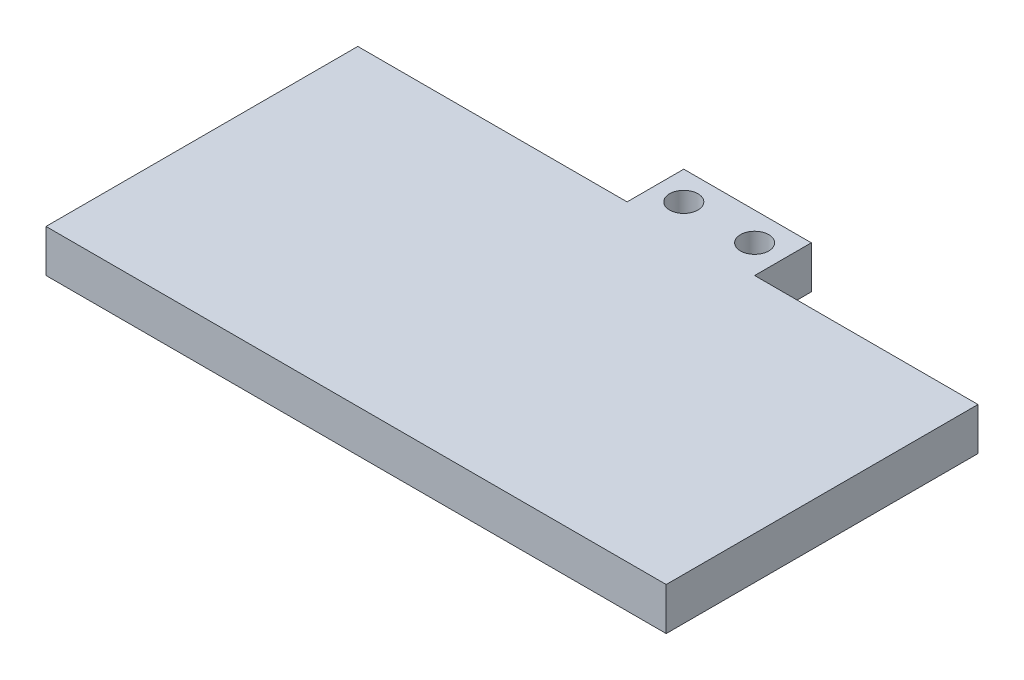
ISO-10303-21;
HEADER;
FILE_DESCRIPTION(('STEP AP214'),'2;1');
FILE_NAME('part.step','',(''),(''),'','','');
FILE_SCHEMA(('AUTOMOTIVE_DESIGN { 1 0 10303 214 1 1 1 1 }'));
ENDSEC;
DATA;
#1=APPLICATION_CONTEXT('core data for automotive mechanical design processes');
#2=APPLICATION_PROTOCOL_DEFINITION('international standard','automotive_design',2000,#1);
#3=PRODUCT_CONTEXT('',#1,'mechanical');
#4=PRODUCT('Part','Part','',(#3));
#5=PRODUCT_RELATED_PRODUCT_CATEGORY('part','',(#4));
#6=PRODUCT_DEFINITION_FORMATION('','',#4);
#7=PRODUCT_DEFINITION_CONTEXT('part definition',#1,'design');
#8=PRODUCT_DEFINITION('design','',#6,#7);
#9=PRODUCT_DEFINITION_SHAPE('','',#8);
#10=(LENGTH_UNIT() NAMED_UNIT(*) SI_UNIT(.MILLI.,.METRE.));
#11=(NAMED_UNIT(*) PLANE_ANGLE_UNIT() SI_UNIT($,.RADIAN.));
#12=(NAMED_UNIT(*) SI_UNIT($,.STERADIAN.) SOLID_ANGLE_UNIT());
#13=UNCERTAINTY_MEASURE_WITH_UNIT(LENGTH_MEASURE(1.E-05),#10,'distance_accuracy_value','');
#14=(GEOMETRIC_REPRESENTATION_CONTEXT(3) GLOBAL_UNCERTAINTY_ASSIGNED_CONTEXT((#13)) GLOBAL_UNIT_ASSIGNED_CONTEXT((#10,
#11,#12)) REPRESENTATION_CONTEXT('',''));
#15=CARTESIAN_POINT('',(0.,0.,0.));
#16=DIRECTION('',(0.,0.,1.));
#17=DIRECTION('',(1.,0.,0.));
#18=AXIS2_PLACEMENT_3D('',#15,#16,#17);
#19=CARTESIAN_POINT('',(0.,19.05,-139.7));
#20=DIRECTION('',(0.,0.,1.));
#21=DIRECTION('',(1.,0.,0.));
#22=AXIS2_PLACEMENT_3D('',#19,#20,#21);
#23=PLANE('',#22);
#24=DIRECTION('',(0.,1.,0.));
#25=VECTOR('',#24,1.);
#26=CARTESIAN_POINT('',(120.65,0.,-139.7));
#27=LINE('',#26,#25);
#28=CARTESIAN_POINT('',(120.65,0.,-139.7));
#29=VERTEX_POINT('',#28);
#30=CARTESIAN_POINT('',(120.65,19.05,-139.7));
#31=VERTEX_POINT('',#30);
#32=EDGE_CURVE('E109',#29,#31,#27,.T.);
#33=ORIENTED_EDGE('',*,*,#32,.F.);
#34=DIRECTION('',(-1.,0.,0.));
#35=VECTOR('',#34,1.);
#36=CARTESIAN_POINT('',(0.,0.,-139.7));
#37=LINE('',#36,#35);
#38=CARTESIAN_POINT('',(0.,0.,-139.7));
#39=VERTEX_POINT('',#38);
#40=EDGE_CURVE('E78',#29,#39,#37,.T.);
#41=ORIENTED_EDGE('',*,*,#40,.T.);
#42=DIRECTION('',(0.,-1.,0.));
#43=VECTOR('',#42,1.);
#44=CARTESIAN_POINT('',(0.,19.05,-139.7));
#45=LINE('',#44,#43);
#46=CARTESIAN_POINT('',(0.,19.05,-139.7));
#47=VERTEX_POINT('',#46);
#48=EDGE_CURVE('E134',#47,#39,#45,.T.);
#49=ORIENTED_EDGE('',*,*,#48,.F.);
#50=DIRECTION('',(-1.,0.,0.));
#51=VECTOR('',#50,1.);
#52=CARTESIAN_POINT('',(0.,19.05,-139.7));
#53=LINE('',#52,#51);
#54=EDGE_CURVE('E56',#31,#47,#53,.T.);
#55=ORIENTED_EDGE('',*,*,#54,.F.);
#56=EDGE_LOOP('',(#33,#41,#49,#55));
#57=FACE_BOUND('',#56,.T.);
#58=ADVANCED_FACE('F32',(#57),#23,.F.);
#59=CARTESIAN_POINT('',(0.,19.05,0.));
#60=DIRECTION('',(1.,0.,0.));
#61=DIRECTION('',(0.,0.,-1.));
#62=AXIS2_PLACEMENT_3D('',#59,#60,#61);
#63=PLANE('',#62);
#64=DIRECTION('',(0.,0.,1.));
#65=VECTOR('',#64,1.);
#66=CARTESIAN_POINT('',(0.,0.,0.));
#67=LINE('',#66,#65);
#68=CARTESIAN_POINT('',(0.,0.,0.));
#69=VERTEX_POINT('',#68);
#70=EDGE_CURVE('E124',#39,#69,#67,.T.);
#71=ORIENTED_EDGE('',*,*,#70,.T.);
#72=DIRECTION('',(0.,-1.,0.));
#73=VECTOR('',#72,1.);
#74=CARTESIAN_POINT('',(0.,19.05,0.));
#75=LINE('',#74,#73);
#76=CARTESIAN_POINT('',(0.,19.05,0.));
#77=VERTEX_POINT('',#76);
#78=EDGE_CURVE('E11',#77,#69,#75,.T.);
#79=ORIENTED_EDGE('',*,*,#78,.F.);
#80=DIRECTION('',(0.,0.,1.));
#81=VECTOR('',#80,1.);
#82=CARTESIAN_POINT('',(0.,19.05,0.));
#83=LINE('',#82,#81);
#84=EDGE_CURVE('E129',#47,#77,#83,.T.);
#85=ORIENTED_EDGE('',*,*,#84,.F.);
#86=ORIENTED_EDGE('',*,*,#48,.T.);
#87=EDGE_LOOP('',(#71,#79,#85,#86));
#88=FACE_BOUND('',#87,.T.);
#89=ADVANCED_FACE('F34',(#88),#63,.F.);
#90=CARTESIAN_POINT('',(0.,19.05,0.));
#91=DIRECTION('',(0.,0.,-1.));
#92=DIRECTION('',(-1.,0.,0.));
#93=AXIS2_PLACEMENT_3D('',#90,#91,#92);
#94=PLANE('',#93);
#95=DIRECTION('',(1.,0.,0.));
#96=VECTOR('',#95,1.);
#97=CARTESIAN_POINT('',(0.,0.,0.));
#98=LINE('',#97,#96);
#99=CARTESIAN_POINT('',(277.876,0.,0.));
#100=VERTEX_POINT('',#99);
#101=EDGE_CURVE('E130',#69,#100,#98,.T.);
#102=ORIENTED_EDGE('',*,*,#101,.T.);
#103=DIRECTION('',(0.,-1.,0.));
#104=VECTOR('',#103,1.);
#105=CARTESIAN_POINT('',(277.876,19.05,0.));
#106=LINE('',#105,#104);
#107=CARTESIAN_POINT('',(277.876,19.05,0.));
#108=VERTEX_POINT('',#107);
#109=EDGE_CURVE('E40',#108,#100,#106,.T.);
#110=ORIENTED_EDGE('',*,*,#109,.F.);
#111=DIRECTION('',(1.,0.,0.));
#112=VECTOR('',#111,1.);
#113=CARTESIAN_POINT('',(0.,19.05,0.));
#114=LINE('',#113,#112);
#115=EDGE_CURVE('E85',#77,#108,#114,.T.);
#116=ORIENTED_EDGE('',*,*,#115,.F.);
#117=ORIENTED_EDGE('',*,*,#78,.T.);
#118=EDGE_LOOP('',(#102,#110,#116,#117));
#119=FACE_BOUND('',#118,.T.);
#120=ADVANCED_FACE('F157',(#119),#94,.F.);
#121=CARTESIAN_POINT('',(277.876,19.05,0.));
#122=DIRECTION('',(-1.,0.,0.));
#123=DIRECTION('',(0.,0.,1.));
#124=AXIS2_PLACEMENT_3D('',#121,#122,#123);
#125=PLANE('',#124);
#126=DIRECTION('',(0.,0.,-1.));
#127=VECTOR('',#126,1.);
#128=CARTESIAN_POINT('',(277.876,0.,0.));
#129=LINE('',#128,#127);
#130=CARTESIAN_POINT('',(277.876,0.,-139.7));
#131=VERTEX_POINT('',#130);
#132=EDGE_CURVE('E126',#100,#131,#129,.T.);
#133=ORIENTED_EDGE('',*,*,#132,.T.);
#134=DIRECTION('',(0.,-1.,0.));
#135=VECTOR('',#134,1.);
#136=CARTESIAN_POINT('',(277.876,19.05,-139.7));
#137=LINE('',#136,#135);
#138=CARTESIAN_POINT('',(277.876,19.05,-139.7));
#139=VERTEX_POINT('',#138);
#140=EDGE_CURVE('E136',#139,#131,#137,.T.);
#141=ORIENTED_EDGE('',*,*,#140,.F.);
#142=DIRECTION('',(0.,0.,-1.));
#143=VECTOR('',#142,1.);
#144=CARTESIAN_POINT('',(277.876,19.05,0.));
#145=LINE('',#144,#143);
#146=EDGE_CURVE('E145',#108,#139,#145,.T.);
#147=ORIENTED_EDGE('',*,*,#146,.F.);
#148=ORIENTED_EDGE('',*,*,#109,.T.);
#149=EDGE_LOOP('',(#133,#141,#147,#148));
#150=FACE_BOUND('',#149,.T.);
#151=ADVANCED_FACE('F143',(#150),#125,.F.);
#152=CARTESIAN_POINT('',(177.8,0.,-139.7));
#153=VERTEX_POINT('',#152);
#154=EDGE_CURVE('E125',#131,#153,#37,.T.);
#155=ORIENTED_EDGE('',*,*,#154,.T.);
#156=DIRECTION('',(0.,1.,0.));
#157=VECTOR('',#156,1.);
#158=CARTESIAN_POINT('',(177.8,0.,-139.7));
#159=LINE('',#158,#157);
#160=CARTESIAN_POINT('',(177.8,19.05,-139.7));
#161=VERTEX_POINT('',#160);
#162=EDGE_CURVE('E117',#153,#161,#159,.T.);
#163=ORIENTED_EDGE('',*,*,#162,.T.);
#164=EDGE_CURVE('E137',#139,#161,#53,.T.);
#165=ORIENTED_EDGE('',*,*,#164,.F.);
#166=ORIENTED_EDGE('',*,*,#140,.T.);
#167=EDGE_LOOP('',(#155,#163,#165,#166));
#168=FACE_BOUND('',#167,.T.);
#169=ADVANCED_FACE('F150',(#168),#23,.F.);
#170=CARTESIAN_POINT('',(0.,19.05,0.));
#171=DIRECTION('',(0.,-1.,0.));
#172=DIRECTION('',(0.,0.,-1.));
#173=AXIS2_PLACEMENT_3D('',#170,#171,#172);
#174=PLANE('',#173);
#175=ORIENTED_EDGE('',*,*,#84,.T.);
#176=ORIENTED_EDGE('',*,*,#115,.T.);
#177=ORIENTED_EDGE('',*,*,#146,.T.);
#178=ORIENTED_EDGE('',*,*,#164,.T.);
#179=DIRECTION('',(0.,0.,-1.));
#180=VECTOR('',#179,1.);
#181=CARTESIAN_POINT('',(177.8,19.05,-139.7));
#182=LINE('',#181,#180);
#183=CARTESIAN_POINT('',(177.8,19.05,-165.1));
#184=VERTEX_POINT('',#183);
#185=EDGE_CURVE('E47',#161,#184,#182,.T.);
#186=ORIENTED_EDGE('',*,*,#185,.T.);
#187=DIRECTION('',(-1.,0.,0.));
#188=VECTOR('',#187,1.);
#189=CARTESIAN_POINT('',(120.65,19.05,-165.1));
#190=LINE('',#189,#188);
#191=CARTESIAN_POINT('',(120.65,19.05,-165.1));
#192=VERTEX_POINT('',#191);
#193=EDGE_CURVE('E115',#184,#192,#190,.T.);
#194=ORIENTED_EDGE('',*,*,#193,.T.);
#195=DIRECTION('',(0.,0.,1.));
#196=VECTOR('',#195,1.);
#197=CARTESIAN_POINT('',(120.65,19.05,-139.7));
#198=LINE('',#197,#196);
#199=EDGE_CURVE('E170',#192,#31,#198,.T.);
#200=ORIENTED_EDGE('',*,*,#199,.T.);
#201=ORIENTED_EDGE('',*,*,#54,.T.);
#202=EDGE_LOOP('',(#175,#176,#177,#178,#186,#194,#200,#201));
#203=FACE_BOUND('',#202,.T.);
#204=CARTESIAN_POINT('',(165.1,19.05,-152.4));
#205=DIRECTION('',(0.,1.,0.));
#206=DIRECTION('',(0.,0.,1.));
#207=AXIS2_PLACEMENT_3D('',#204,#205,#206);
#208=CIRCLE('',#207,6.34999999999999);
#209=CARTESIAN_POINT('',(165.1,19.05,-146.05));
#210=VERTEX_POINT('',#209);
#211=EDGE_CURVE('E181',#210,#210,#208,.T.);
#212=ORIENTED_EDGE('',*,*,#211,.F.);
#213=EDGE_LOOP('',(#212));
#214=FACE_BOUND('',#213,.T.);
#215=CARTESIAN_POINT('',(133.35,19.05,-152.4));
#216=DIRECTION('',(0.,1.,0.));
#217=DIRECTION('',(0.,0.,1.));
#218=AXIS2_PLACEMENT_3D('',#215,#216,#217);
#219=CIRCLE('',#218,6.34999999999999);
#220=CARTESIAN_POINT('',(133.35,19.05,-146.05));
#221=VERTEX_POINT('',#220);
#222=EDGE_CURVE('E175',#221,#221,#219,.T.);
#223=ORIENTED_EDGE('',*,*,#222,.F.);
#224=EDGE_LOOP('',(#223));
#225=FACE_BOUND('',#224,.T.);
#226=ADVANCED_FACE('F195',(#203,#214,#225),#174,.F.);
#227=CARTESIAN_POINT('',(0.,0.,0.));
#228=DIRECTION('',(0.,-1.,0.));
#229=DIRECTION('',(0.,0.,-1.));
#230=AXIS2_PLACEMENT_3D('',#227,#228,#229);
#231=PLANE('',#230);
#232=ORIENTED_EDGE('',*,*,#70,.F.);
#233=ORIENTED_EDGE('',*,*,#40,.F.);
#234=DIRECTION('',(0.,0.,1.));
#235=VECTOR('',#234,1.);
#236=CARTESIAN_POINT('',(120.65,0.,-139.7));
#237=LINE('',#236,#235);
#238=CARTESIAN_POINT('',(120.65,0.,-165.1));
#239=VERTEX_POINT('',#238);
#240=EDGE_CURVE('E106',#239,#29,#237,.T.);
#241=ORIENTED_EDGE('',*,*,#240,.F.);
#242=DIRECTION('',(-1.,0.,0.));
#243=VECTOR('',#242,1.);
#244=CARTESIAN_POINT('',(120.65,0.,-165.1));
#245=LINE('',#244,#243);
#246=CARTESIAN_POINT('',(177.8,0.,-165.1));
#247=VERTEX_POINT('',#246);
#248=EDGE_CURVE('E118',#247,#239,#245,.T.);
#249=ORIENTED_EDGE('',*,*,#248,.F.);
#250=DIRECTION('',(0.,0.,-1.));
#251=VECTOR('',#250,1.);
#252=CARTESIAN_POINT('',(177.8,0.,-139.7));
#253=LINE('',#252,#251);
#254=EDGE_CURVE('E114',#153,#247,#253,.T.);
#255=ORIENTED_EDGE('',*,*,#254,.F.);
#256=ORIENTED_EDGE('',*,*,#154,.F.);
#257=ORIENTED_EDGE('',*,*,#132,.F.);
#258=ORIENTED_EDGE('',*,*,#101,.F.);
#259=EDGE_LOOP('',(#232,#233,#241,#249,#255,#256,#257,#258));
#260=FACE_BOUND('',#259,.T.);
#261=CARTESIAN_POINT('',(165.1,0.,-152.4));
#262=DIRECTION('',(0.,1.,0.));
#263=DIRECTION('',(0.,0.,1.));
#264=AXIS2_PLACEMENT_3D('',#261,#262,#263);
#265=CIRCLE('',#264,6.34999999999999);
#266=CARTESIAN_POINT('',(165.1,0.,-146.05));
#267=VERTEX_POINT('',#266);
#268=EDGE_CURVE('E178',#267,#267,#265,.T.);
#269=ORIENTED_EDGE('',*,*,#268,.T.);
#270=EDGE_LOOP('',(#269));
#271=FACE_BOUND('',#270,.T.);
#272=CARTESIAN_POINT('',(133.35,0.,-152.4));
#273=DIRECTION('',(0.,1.,0.));
#274=DIRECTION('',(0.,0.,1.));
#275=AXIS2_PLACEMENT_3D('',#272,#273,#274);
#276=CIRCLE('',#275,6.34999999999999);
#277=CARTESIAN_POINT('',(133.35,0.,-146.05));
#278=VERTEX_POINT('',#277);
#279=EDGE_CURVE('E172',#278,#278,#276,.T.);
#280=ORIENTED_EDGE('',*,*,#279,.T.);
#281=EDGE_LOOP('',(#280));
#282=FACE_BOUND('',#281,.T.);
#283=ADVANCED_FACE('F121',(#260,#271,#282),#231,.T.);
#284=CARTESIAN_POINT('',(120.65,0.,-139.7));
#285=DIRECTION('',(-1.,0.,0.));
#286=DIRECTION('',(0.,0.,1.));
#287=AXIS2_PLACEMENT_3D('',#284,#285,#286);
#288=PLANE('',#287);
#289=ORIENTED_EDGE('',*,*,#199,.F.);
#290=DIRECTION('',(0.,1.,0.));
#291=VECTOR('',#290,1.);
#292=CARTESIAN_POINT('',(120.65,0.,-165.1));
#293=LINE('',#292,#291);
#294=EDGE_CURVE('E110',#239,#192,#293,.T.);
#295=ORIENTED_EDGE('',*,*,#294,.F.);
#296=ORIENTED_EDGE('',*,*,#240,.T.);
#297=ORIENTED_EDGE('',*,*,#32,.T.);
#298=EDGE_LOOP('',(#289,#295,#296,#297));
#299=FACE_BOUND('',#298,.T.);
#300=ADVANCED_FACE('F108',(#299),#288,.T.);
#301=CARTESIAN_POINT('',(120.65,0.,-165.1));
#302=DIRECTION('',(0.,0.,-1.));
#303=DIRECTION('',(-1.,0.,0.));
#304=AXIS2_PLACEMENT_3D('',#301,#302,#303);
#305=PLANE('',#304);
#306=ORIENTED_EDGE('',*,*,#193,.F.);
#307=DIRECTION('',(0.,1.,0.));
#308=VECTOR('',#307,1.);
#309=CARTESIAN_POINT('',(177.8,0.,-165.1));
#310=LINE('',#309,#308);
#311=EDGE_CURVE('E164',#247,#184,#310,.T.);
#312=ORIENTED_EDGE('',*,*,#311,.F.);
#313=ORIENTED_EDGE('',*,*,#248,.T.);
#314=ORIENTED_EDGE('',*,*,#294,.T.);
#315=EDGE_LOOP('',(#306,#312,#313,#314));
#316=FACE_BOUND('',#315,.T.);
#317=ADVANCED_FACE('F208',(#316),#305,.T.);
#318=CARTESIAN_POINT('',(177.8,0.,-139.7));
#319=DIRECTION('',(1.,0.,0.));
#320=DIRECTION('',(0.,0.,-1.));
#321=AXIS2_PLACEMENT_3D('',#318,#319,#320);
#322=PLANE('',#321);
#323=ORIENTED_EDGE('',*,*,#185,.F.);
#324=ORIENTED_EDGE('',*,*,#162,.F.);
#325=ORIENTED_EDGE('',*,*,#254,.T.);
#326=ORIENTED_EDGE('',*,*,#311,.T.);
#327=EDGE_LOOP('',(#323,#324,#325,#326));
#328=FACE_BOUND('',#327,.T.);
#329=ADVANCED_FACE('F202',(#328),#322,.T.);
#330=CARTESIAN_POINT('',(133.35,0.,-152.4));
#331=DIRECTION('',(0.,1.,0.));
#332=DIRECTION('',(0.,0.,1.));
#333=AXIS2_PLACEMENT_3D('',#330,#331,#332);
#334=CYLINDRICAL_SURFACE('',#333,6.34999999999999);
#335=CARTESIAN_POINT('',(133.35,0.,-146.05));
#336=CARTESIAN_POINT('',(133.35,0.1984375,-146.05));
#337=CARTESIAN_POINT('',(133.35,0.396875,-146.05));
#338=CARTESIAN_POINT('',(133.35,0.79375,-146.05));
#339=CARTESIAN_POINT('',(133.35,0.9921875,-146.05));
#340=CARTESIAN_POINT('',(133.35,1.3890625,-146.05));
#341=CARTESIAN_POINT('',(133.35,1.5875,-146.05));
#342=CARTESIAN_POINT('',(133.35,1.984375,-146.05));
#343=CARTESIAN_POINT('',(133.35,2.1828125,-146.05));
#344=CARTESIAN_POINT('',(133.35,2.5796875,-146.05));
#345=CARTESIAN_POINT('',(133.35,2.778125,-146.05));
#346=CARTESIAN_POINT('',(133.35,3.175,-146.05));
#347=CARTESIAN_POINT('',(133.35,3.3734375,-146.05));
#348=CARTESIAN_POINT('',(133.35,3.7703125,-146.05));
#349=CARTESIAN_POINT('',(133.35,3.96875,-146.05));
#350=CARTESIAN_POINT('',(133.35,4.365625,-146.05));
#351=CARTESIAN_POINT('',(133.35,4.5640625,-146.05));
#352=CARTESIAN_POINT('',(133.35,4.9609375,-146.05));
#353=CARTESIAN_POINT('',(133.35,5.159375,-146.05));
#354=CARTESIAN_POINT('',(133.35,5.55625,-146.05));
#355=CARTESIAN_POINT('',(133.35,5.7546875,-146.05));
#356=CARTESIAN_POINT('',(133.35,6.1515625,-146.05));
#357=CARTESIAN_POINT('',(133.35,6.35,-146.05));
#358=CARTESIAN_POINT('',(133.35,6.746875,-146.05));
#359=CARTESIAN_POINT('',(133.35,6.9453125,-146.05));
#360=CARTESIAN_POINT('',(133.35,7.3421875,-146.05));
#361=CARTESIAN_POINT('',(133.35,7.540625,-146.05));
#362=CARTESIAN_POINT('',(133.35,7.9375,-146.05));
#363=CARTESIAN_POINT('',(133.35,8.1359375,-146.05));
#364=CARTESIAN_POINT('',(133.35,8.5328125,-146.05));
#365=CARTESIAN_POINT('',(133.35,8.73125,-146.05));
#366=CARTESIAN_POINT('',(133.35,9.128125,-146.05));
#367=CARTESIAN_POINT('',(133.35,9.3265625,-146.05));
#368=CARTESIAN_POINT('',(133.35,9.7234375,-146.05));
#369=CARTESIAN_POINT('',(133.35,9.921875,-146.05));
#370=CARTESIAN_POINT('',(133.35,10.31875,-146.05));
#371=CARTESIAN_POINT('',(133.35,10.5171875,-146.05));
#372=CARTESIAN_POINT('',(133.35,10.9140625,-146.05));
#373=CARTESIAN_POINT('',(133.35,11.1125,-146.05));
#374=CARTESIAN_POINT('',(133.35,11.509375,-146.05));
#375=CARTESIAN_POINT('',(133.35,11.7078125,-146.05));
#376=CARTESIAN_POINT('',(133.35,12.1046875,-146.05));
#377=CARTESIAN_POINT('',(133.35,12.303125,-146.05));
#378=CARTESIAN_POINT('',(133.35,12.7,-146.05));
#379=CARTESIAN_POINT('',(133.35,12.8984375,-146.05));
#380=CARTESIAN_POINT('',(133.35,13.2953125,-146.05));
#381=CARTESIAN_POINT('',(133.35,13.49375,-146.05));
#382=CARTESIAN_POINT('',(133.35,13.890625,-146.05));
#383=CARTESIAN_POINT('',(133.35,14.0890625,-146.05));
#384=CARTESIAN_POINT('',(133.35,14.4859375,-146.05));
#385=CARTESIAN_POINT('',(133.35,14.684375,-146.05));
#386=CARTESIAN_POINT('',(133.35,15.08125,-146.05));
#387=CARTESIAN_POINT('',(133.35,15.2796875,-146.05));
#388=CARTESIAN_POINT('',(133.35,15.6765625,-146.05));
#389=CARTESIAN_POINT('',(133.35,15.875,-146.05));
#390=CARTESIAN_POINT('',(133.35,16.271875,-146.05));
#391=CARTESIAN_POINT('',(133.35,16.4703125,-146.05));
#392=CARTESIAN_POINT('',(133.35,16.8671875,-146.05));
#393=CARTESIAN_POINT('',(133.35,17.065625,-146.05));
#394=CARTESIAN_POINT('',(133.35,17.4625,-146.05));
#395=CARTESIAN_POINT('',(133.35,17.6609375,-146.05));
#396=CARTESIAN_POINT('',(133.35,18.0578125,-146.05));
#397=CARTESIAN_POINT('',(133.35,18.25625,-146.05));
#398=CARTESIAN_POINT('',(133.35,18.653125,-146.05));
#399=CARTESIAN_POINT('',(133.35,18.8515625,-146.05));
#400=CARTESIAN_POINT('',(133.35,19.05,-146.05));
#401=B_SPLINE_CURVE_WITH_KNOTS('',3,(#335,#336,#337,#338,#339,#340,#341,#342,#343,#344,#345,
#346,#347,#348,#349,#350,#351,#352,#353,#354,#355,#356,#357,#358,#359,#360,#361,#362,#363,#364,
#365,#366,#367,#368,#369,#370,#371,#372,#373,#374,#375,#376,#377,#378,#379,#380,#381,#382,#383,
#384,#385,#386,#387,#388,#389,#390,#391,#392,#393,#394,#395,#396,#397,#398,#399,#400),
.UNSPECIFIED.,.F.,.F.,(4,2,2,2,2,2,2,2,2,2,2,2,2,2,2,2,2,2,2,2,2,2,2,2,2,2,2,2,2,2,2,2,4),(0.,
0.5953125,1.190625,1.7859375,2.38125,2.9765625,3.571875,4.1671875,4.7625,5.3578125,5.953125,
6.5484375,7.14375,7.7390625,8.334375,8.9296875,9.525,10.1203125,10.715625,11.3109375,11.90625,
12.5015625,13.096875,13.6921875,14.2875,14.8828125,15.478125,16.0734375,16.66875,17.2640625,
17.859375,18.4546875,19.05),.UNSPECIFIED.);
#402=EDGE_CURVE('BSEAM191',#278,#221,#401,.T.);
#403=ORIENTED_EDGE('',*,*,#279,.F.);
#404=ORIENTED_EDGE('',*,*,#222,.T.);
#405=ORIENTED_EDGE('',*,*,#402,.T.);
#406=ORIENTED_EDGE('',*,*,#402,.F.);
#407=EDGE_LOOP('',(#403,#405,#404,#406));
#408=FACE_BOUND('',#407,.T.);
#409=ADVANCED_FACE('F191',(#408),#334,.F.);
#410=CARTESIAN_POINT('',(165.1,0.,-152.4));
#411=DIRECTION('',(0.,1.,0.));
#412=DIRECTION('',(0.,0.,1.));
#413=AXIS2_PLACEMENT_3D('',#410,#411,#412);
#414=CYLINDRICAL_SURFACE('',#413,6.34999999999999);
#415=CARTESIAN_POINT('',(165.1,0.,-146.05));
#416=CARTESIAN_POINT('',(165.1,0.1984375,-146.05));
#417=CARTESIAN_POINT('',(165.1,0.396875,-146.05));
#418=CARTESIAN_POINT('',(165.1,0.79375,-146.05));
#419=CARTESIAN_POINT('',(165.1,0.9921875,-146.05));
#420=CARTESIAN_POINT('',(165.1,1.3890625,-146.05));
#421=CARTESIAN_POINT('',(165.1,1.5875,-146.05));
#422=CARTESIAN_POINT('',(165.1,1.984375,-146.05));
#423=CARTESIAN_POINT('',(165.1,2.1828125,-146.05));
#424=CARTESIAN_POINT('',(165.1,2.5796875,-146.05));
#425=CARTESIAN_POINT('',(165.1,2.778125,-146.05));
#426=CARTESIAN_POINT('',(165.1,3.175,-146.05));
#427=CARTESIAN_POINT('',(165.1,3.3734375,-146.05));
#428=CARTESIAN_POINT('',(165.1,3.7703125,-146.05));
#429=CARTESIAN_POINT('',(165.1,3.96875,-146.05));
#430=CARTESIAN_POINT('',(165.1,4.365625,-146.05));
#431=CARTESIAN_POINT('',(165.1,4.5640625,-146.05));
#432=CARTESIAN_POINT('',(165.1,4.9609375,-146.05));
#433=CARTESIAN_POINT('',(165.1,5.159375,-146.05));
#434=CARTESIAN_POINT('',(165.1,5.55625,-146.05));
#435=CARTESIAN_POINT('',(165.1,5.7546875,-146.05));
#436=CARTESIAN_POINT('',(165.1,6.1515625,-146.05));
#437=CARTESIAN_POINT('',(165.1,6.35,-146.05));
#438=CARTESIAN_POINT('',(165.1,6.746875,-146.05));
#439=CARTESIAN_POINT('',(165.1,6.9453125,-146.05));
#440=CARTESIAN_POINT('',(165.1,7.3421875,-146.05));
#441=CARTESIAN_POINT('',(165.1,7.540625,-146.05));
#442=CARTESIAN_POINT('',(165.1,7.9375,-146.05));
#443=CARTESIAN_POINT('',(165.1,8.1359375,-146.05));
#444=CARTESIAN_POINT('',(165.1,8.5328125,-146.05));
#445=CARTESIAN_POINT('',(165.1,8.73125,-146.05));
#446=CARTESIAN_POINT('',(165.1,9.128125,-146.05));
#447=CARTESIAN_POINT('',(165.1,9.3265625,-146.05));
#448=CARTESIAN_POINT('',(165.1,9.7234375,-146.05));
#449=CARTESIAN_POINT('',(165.1,9.921875,-146.05));
#450=CARTESIAN_POINT('',(165.1,10.31875,-146.05));
#451=CARTESIAN_POINT('',(165.1,10.5171875,-146.05));
#452=CARTESIAN_POINT('',(165.1,10.9140625,-146.05));
#453=CARTESIAN_POINT('',(165.1,11.1125,-146.05));
#454=CARTESIAN_POINT('',(165.1,11.509375,-146.05));
#455=CARTESIAN_POINT('',(165.1,11.7078125,-146.05));
#456=CARTESIAN_POINT('',(165.1,12.1046875,-146.05));
#457=CARTESIAN_POINT('',(165.1,12.303125,-146.05));
#458=CARTESIAN_POINT('',(165.1,12.7,-146.05));
#459=CARTESIAN_POINT('',(165.1,12.8984375,-146.05));
#460=CARTESIAN_POINT('',(165.1,13.2953125,-146.05));
#461=CARTESIAN_POINT('',(165.1,13.49375,-146.05));
#462=CARTESIAN_POINT('',(165.1,13.890625,-146.05));
#463=CARTESIAN_POINT('',(165.1,14.0890625,-146.05));
#464=CARTESIAN_POINT('',(165.1,14.4859375,-146.05));
#465=CARTESIAN_POINT('',(165.1,14.684375,-146.05));
#466=CARTESIAN_POINT('',(165.1,15.08125,-146.05));
#467=CARTESIAN_POINT('',(165.1,15.2796875,-146.05));
#468=CARTESIAN_POINT('',(165.1,15.6765625,-146.05));
#469=CARTESIAN_POINT('',(165.1,15.875,-146.05));
#470=CARTESIAN_POINT('',(165.1,16.271875,-146.05));
#471=CARTESIAN_POINT('',(165.1,16.4703125,-146.05));
#472=CARTESIAN_POINT('',(165.1,16.8671875,-146.05));
#473=CARTESIAN_POINT('',(165.1,17.065625,-146.05));
#474=CARTESIAN_POINT('',(165.1,17.4625,-146.05));
#475=CARTESIAN_POINT('',(165.1,17.6609375,-146.05));
#476=CARTESIAN_POINT('',(165.1,18.0578125,-146.05));
#477=CARTESIAN_POINT('',(165.1,18.25625,-146.05));
#478=CARTESIAN_POINT('',(165.1,18.653125,-146.05));
#479=CARTESIAN_POINT('',(165.1,18.8515625,-146.05));
#480=CARTESIAN_POINT('',(165.1,19.05,-146.05));
#481=B_SPLINE_CURVE_WITH_KNOTS('',3,(#415,#416,#417,#418,#419,#420,#421,#422,#423,#424,#425,
#426,#427,#428,#429,#430,#431,#432,#433,#434,#435,#436,#437,#438,#439,#440,#441,#442,#443,#444,
#445,#446,#447,#448,#449,#450,#451,#452,#453,#454,#455,#456,#457,#458,#459,#460,#461,#462,#463,
#464,#465,#466,#467,#468,#469,#470,#471,#472,#473,#474,#475,#476,#477,#478,#479,#480),
.UNSPECIFIED.,.F.,.F.,(4,2,2,2,2,2,2,2,2,2,2,2,2,2,2,2,2,2,2,2,2,2,2,2,2,2,2,2,2,2,2,2,4),(0.,
0.5953125,1.190625,1.7859375,2.38125,2.9765625,3.571875,4.1671875,4.7625,5.3578125,5.953125,
6.5484375,7.14375,7.7390625,8.334375,8.9296875,9.525,10.1203125,10.715625,11.3109375,11.90625,
12.5015625,13.096875,13.6921875,14.2875,14.8828125,15.478125,16.0734375,16.66875,17.2640625,
17.859375,18.4546875,19.05),.UNSPECIFIED.);
#482=EDGE_CURVE('BSEAM188',#267,#210,#481,.T.);
#483=ORIENTED_EDGE('',*,*,#268,.F.);
#484=ORIENTED_EDGE('',*,*,#211,.T.);
#485=ORIENTED_EDGE('',*,*,#482,.T.);
#486=ORIENTED_EDGE('',*,*,#482,.F.);
#487=EDGE_LOOP('',(#483,#485,#484,#486));
#488=FACE_BOUND('',#487,.T.);
#489=ADVANCED_FACE('F188',(#488),#414,.F.);
#490=CLOSED_SHELL('',(#58,#89,#120,#151,#169,#226,#283,#300,#317,#329,#409,#489));
#491=MANIFOLD_SOLID_BREP('B2',#490);
#492=ADVANCED_BREP_SHAPE_REPRESENTATION('',(#18,#491),#14);
#493=SHAPE_DEFINITION_REPRESENTATION(#9,#492);
ENDSEC;
END-ISO-10303-21;
